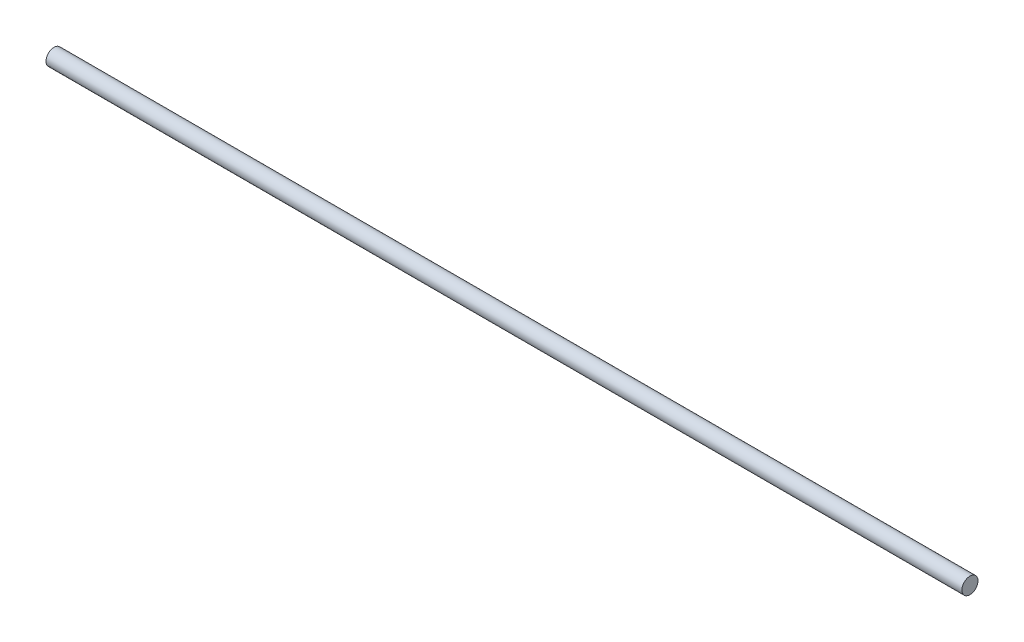
ISO-10303-21;
HEADER;
FILE_DESCRIPTION(('STEP AP214'),'2;1');
FILE_NAME('part.step','',(''),(''),'','','');
FILE_SCHEMA(('AUTOMOTIVE_DESIGN { 1 0 10303 214 1 1 1 1 }'));
ENDSEC;
DATA;
#1=APPLICATION_CONTEXT('core data for automotive mechanical design processes');
#2=APPLICATION_PROTOCOL_DEFINITION('international standard','automotive_design',2000,#1);
#3=PRODUCT_CONTEXT('',#1,'mechanical');
#4=PRODUCT('Part','Part','',(#3));
#5=PRODUCT_RELATED_PRODUCT_CATEGORY('part','',(#4));
#6=PRODUCT_DEFINITION_FORMATION('','',#4);
#7=PRODUCT_DEFINITION_CONTEXT('part definition',#1,'design');
#8=PRODUCT_DEFINITION('design','',#6,#7);
#9=PRODUCT_DEFINITION_SHAPE('','',#8);
#10=(LENGTH_UNIT() NAMED_UNIT(*) SI_UNIT(.MILLI.,.METRE.));
#11=(NAMED_UNIT(*) PLANE_ANGLE_UNIT() SI_UNIT($,.RADIAN.));
#12=(NAMED_UNIT(*) SI_UNIT($,.STERADIAN.) SOLID_ANGLE_UNIT());
#13=UNCERTAINTY_MEASURE_WITH_UNIT(LENGTH_MEASURE(1.E-05),#10,'distance_accuracy_value','');
#14=(GEOMETRIC_REPRESENTATION_CONTEXT(3) GLOBAL_UNCERTAINTY_ASSIGNED_CONTEXT((#13)) GLOBAL_UNIT_ASSIGNED_CONTEXT((#10,
#11,#12)) REPRESENTATION_CONTEXT('',''));
#15=CARTESIAN_POINT('',(0.,0.,0.));
#16=DIRECTION('',(0.,0.,1.));
#17=DIRECTION('',(1.,0.,0.));
#18=AXIS2_PLACEMENT_3D('',#15,#16,#17);
#19=CARTESIAN_POINT('',(431.8,0.,0.));
#20=DIRECTION('',(-1.,0.,0.));
#21=DIRECTION('',(0.,0.,1.));
#22=AXIS2_PLACEMENT_3D('',#19,#20,#21);
#23=CYLINDRICAL_SURFACE('',#22,7.6);
#24=CARTESIAN_POINT('',(431.8,0.,0.));
#25=DIRECTION('',(1.,0.,0.));
#26=DIRECTION('',(0.,0.,-1.));
#27=AXIS2_PLACEMENT_3D('',#24,#25,#26);
#28=CIRCLE('',#27,7.6);
#29=CARTESIAN_POINT('',(431.8,0.,-7.6));
#30=VERTEX_POINT('',#29);
#31=EDGE_CURVE('E10',#30,#30,#28,.T.);
#32=ORIENTED_EDGE('',*,*,#31,.F.);
#33=EDGE_LOOP('',(#32));
#34=FACE_BOUND('',#33,.T.);
#35=CARTESIAN_POINT('',(-431.8,0.,0.));
#36=DIRECTION('',(1.,0.,0.));
#37=DIRECTION('',(0.,0.,-1.));
#38=AXIS2_PLACEMENT_3D('',#35,#36,#37);
#39=CIRCLE('',#38,7.6);
#40=CARTESIAN_POINT('',(-431.8,0.,-7.6));
#41=VERTEX_POINT('',#40);
#42=EDGE_CURVE('E42',#41,#41,#39,.T.);
#43=ORIENTED_EDGE('',*,*,#42,.T.);
#44=EDGE_LOOP('',(#43));
#45=FACE_BOUND('',#44,.T.);
#46=ADVANCED_FACE('F36',(#34,#45),#23,.T.);
#47=CARTESIAN_POINT('',(431.8,0.,0.));
#48=DIRECTION('',(1.,0.,0.));
#49=DIRECTION('',(0.,0.,-1.));
#50=AXIS2_PLACEMENT_3D('',#47,#48,#49);
#51=PLANE('',#50);
#52=ORIENTED_EDGE('',*,*,#31,.T.);
#53=EDGE_LOOP('',(#52));
#54=FACE_BOUND('',#53,.T.);
#55=ADVANCED_FACE('F51',(#54),#51,.T.);
#56=CARTESIAN_POINT('',(-431.8,0.,0.));
#57=DIRECTION('',(1.,0.,0.));
#58=DIRECTION('',(0.,0.,-1.));
#59=AXIS2_PLACEMENT_3D('',#56,#57,#58);
#60=PLANE('',#59);
#61=ORIENTED_EDGE('',*,*,#42,.F.);
#62=EDGE_LOOP('',(#61));
#63=FACE_BOUND('',#62,.T.);
#64=ADVANCED_FACE('F49',(#63),#60,.F.);
#65=CLOSED_SHELL('',(#46,#55,#64));
#66=MANIFOLD_SOLID_BREP('B2',#65);
#67=ADVANCED_BREP_SHAPE_REPRESENTATION('',(#18,#66),#14);
#68=SHAPE_DEFINITION_REPRESENTATION(#9,#67);
ENDSEC;
END-ISO-10303-21;
